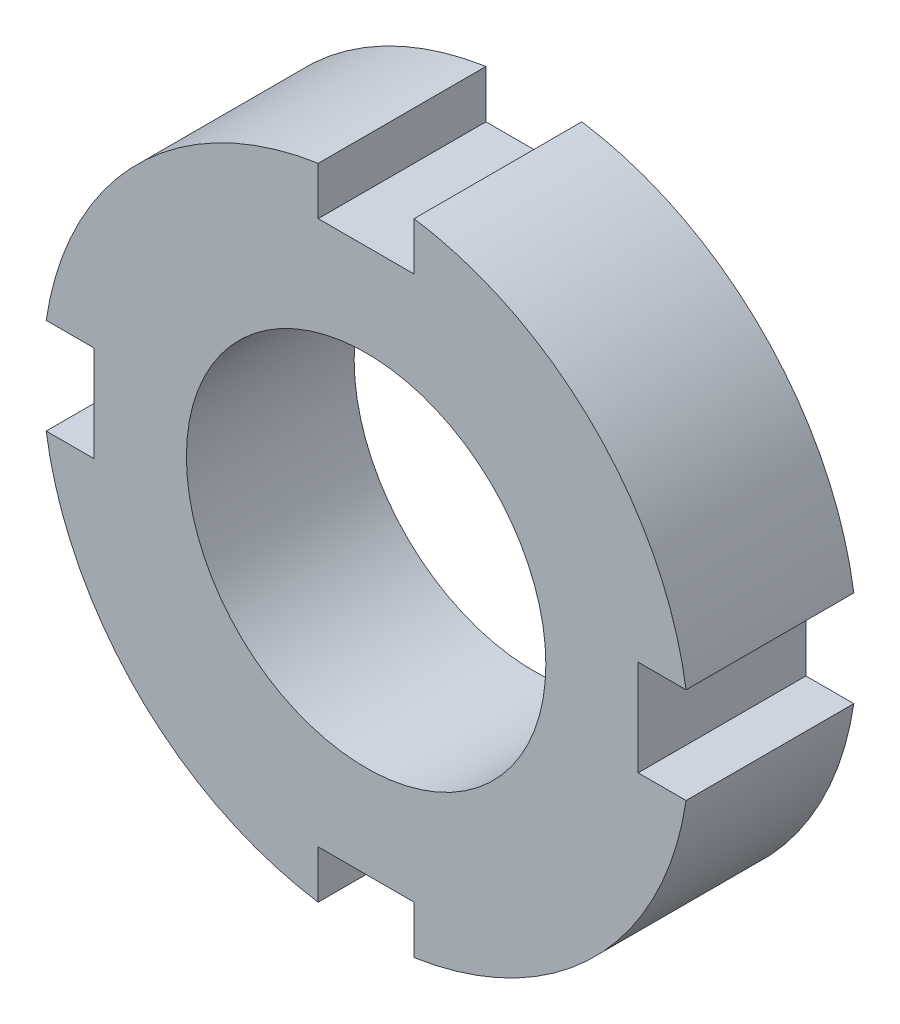
ISO-10303-21;
HEADER;
FILE_DESCRIPTION(('STEP AP214'),'2;1');
FILE_NAME('part.step','',(''),(''),'','','');
FILE_SCHEMA(('AUTOMOTIVE_DESIGN { 1 0 10303 214 1 1 1 1 }'));
ENDSEC;
DATA;
#1=APPLICATION_CONTEXT('core data for automotive mechanical design processes');
#2=APPLICATION_PROTOCOL_DEFINITION('international standard','automotive_design',2000,#1);
#3=PRODUCT_CONTEXT('',#1,'mechanical');
#4=PRODUCT('Part','Part','',(#3));
#5=PRODUCT_RELATED_PRODUCT_CATEGORY('part','',(#4));
#6=PRODUCT_DEFINITION_FORMATION('','',#4);
#7=PRODUCT_DEFINITION_CONTEXT('part definition',#1,'design');
#8=PRODUCT_DEFINITION('design','',#6,#7);
#9=PRODUCT_DEFINITION_SHAPE('','',#8);
#10=(LENGTH_UNIT() NAMED_UNIT(*) SI_UNIT(.MILLI.,.METRE.));
#11=(NAMED_UNIT(*) PLANE_ANGLE_UNIT() SI_UNIT($,.RADIAN.));
#12=(NAMED_UNIT(*) SI_UNIT($,.STERADIAN.) SOLID_ANGLE_UNIT());
#13=UNCERTAINTY_MEASURE_WITH_UNIT(LENGTH_MEASURE(1.E-05),#10,'distance_accuracy_value','');
#14=(GEOMETRIC_REPRESENTATION_CONTEXT(3) GLOBAL_UNCERTAINTY_ASSIGNED_CONTEXT((#13)) GLOBAL_UNIT_ASSIGNED_CONTEXT((#10,
#11,#12)) REPRESENTATION_CONTEXT('',''));
#15=CARTESIAN_POINT('',(0.,0.,0.));
#16=DIRECTION('',(0.,0.,1.));
#17=DIRECTION('',(1.,0.,0.));
#18=AXIS2_PLACEMENT_3D('',#15,#16,#17);
#19=CARTESIAN_POINT('',(0.,2.,7.));
#20=DIRECTION('',(0.,1.,0.));
#21=DIRECTION('',(-1.,0.,0.));
#22=AXIS2_PLACEMENT_3D('',#19,#20,#21);
#23=PLANE('',#22);
#24=DIRECTION('',(1.,0.,0.));
#25=VECTOR('',#24,1.);
#26=CARTESIAN_POINT('',(0.,2.,0.));
#27=LINE('',#26,#25);
#28=CARTESIAN_POINT('',(11.3510299228187,2.,0.));
#29=VERTEX_POINT('',#28);
#30=CARTESIAN_POINT('',(13.3510299228187,2.,0.));
#31=VERTEX_POINT('',#30);
#32=EDGE_CURVE('E198',#29,#31,#27,.T.);
#33=ORIENTED_EDGE('',*,*,#32,.T.);
#34=DIRECTION('',(0.,0.,-1.));
#35=VECTOR('',#34,1.);
#36=CARTESIAN_POINT('',(13.3510299228187,2.,7.));
#37=LINE('',#36,#35);
#38=CARTESIAN_POINT('',(13.3510299228187,2.,7.));
#39=VERTEX_POINT('',#38);
#40=EDGE_CURVE('E11',#39,#31,#37,.T.);
#41=ORIENTED_EDGE('',*,*,#40,.F.);
#42=DIRECTION('',(1.,0.,0.));
#43=VECTOR('',#42,1.);
#44=CARTESIAN_POINT('',(0.,2.,7.));
#45=LINE('',#44,#43);
#46=CARTESIAN_POINT('',(11.3510299228187,2.,7.));
#47=VERTEX_POINT('',#46);
#48=EDGE_CURVE('E311',#47,#39,#45,.T.);
#49=ORIENTED_EDGE('',*,*,#48,.F.);
#50=DIRECTION('',(0.,0.,-1.));
#51=VECTOR('',#50,1.);
#52=CARTESIAN_POINT('',(11.3510299228187,2.,7.));
#53=LINE('',#52,#51);
#54=EDGE_CURVE('E59',#47,#29,#53,.T.);
#55=ORIENTED_EDGE('',*,*,#54,.T.);
#56=EDGE_LOOP('',(#33,#41,#49,#55));
#57=FACE_BOUND('',#56,.T.);
#58=ADVANCED_FACE('F41',(#57),#23,.F.);
#59=CARTESIAN_POINT('',(0.,0.,7.));
#60=DIRECTION('',(0.,0.,-1.));
#61=DIRECTION('',(-1.,0.,0.));
#62=AXIS2_PLACEMENT_3D('',#59,#60,#61);
#63=CYLINDRICAL_SURFACE('',#62,13.5);
#64=CARTESIAN_POINT('',(0.,0.,0.));
#65=DIRECTION('',(0.,0.,1.));
#66=DIRECTION('',(1.,0.,0.));
#67=AXIS2_PLACEMENT_3D('',#64,#65,#66);
#68=CIRCLE('',#67,13.5);
#69=CARTESIAN_POINT('',(2.,13.3510299228187,0.));
#70=VERTEX_POINT('',#69);
#71=EDGE_CURVE('E201',#31,#70,#68,.T.);
#72=ORIENTED_EDGE('',*,*,#71,.T.);
#73=DIRECTION('',(0.,0.,-1.));
#74=VECTOR('',#73,1.);
#75=CARTESIAN_POINT('',(2.,13.3510299228187,7.));
#76=LINE('',#75,#74);
#77=CARTESIAN_POINT('',(2.,13.3510299228187,7.));
#78=VERTEX_POINT('',#77);
#79=EDGE_CURVE('E51',#78,#70,#76,.T.);
#80=ORIENTED_EDGE('',*,*,#79,.F.);
#81=CARTESIAN_POINT('',(0.,0.,7.));
#82=DIRECTION('',(0.,0.,1.));
#83=DIRECTION('',(1.,0.,0.));
#84=AXIS2_PLACEMENT_3D('',#81,#82,#83);
#85=CIRCLE('',#84,13.5);
#86=EDGE_CURVE('E121',#39,#78,#85,.T.);
#87=ORIENTED_EDGE('',*,*,#86,.F.);
#88=ORIENTED_EDGE('',*,*,#40,.T.);
#89=EDGE_LOOP('',(#72,#80,#87,#88));
#90=FACE_BOUND('',#89,.T.);
#91=ADVANCED_FACE('F292',(#90),#63,.T.);
#92=CARTESIAN_POINT('',(2.,0.,7.));
#93=DIRECTION('',(-1.,0.,0.));
#94=DIRECTION('',(0.,0.,1.));
#95=AXIS2_PLACEMENT_3D('',#92,#93,#94);
#96=PLANE('',#95);
#97=DIRECTION('',(0.,1.,0.));
#98=VECTOR('',#97,1.);
#99=CARTESIAN_POINT('',(2.,0.,0.));
#100=LINE('',#99,#98);
#101=CARTESIAN_POINT('',(2.,11.3510299228187,0.));
#102=VERTEX_POINT('',#101);
#103=EDGE_CURVE('E205',#102,#70,#100,.T.);
#104=ORIENTED_EDGE('',*,*,#103,.F.);
#105=DIRECTION('',(0.,0.,-1.));
#106=VECTOR('',#105,1.);
#107=CARTESIAN_POINT('',(2.,11.3510299228187,7.));
#108=LINE('',#107,#106);
#109=CARTESIAN_POINT('',(2.,11.3510299228187,7.));
#110=VERTEX_POINT('',#109);
#111=EDGE_CURVE('E283',#110,#102,#108,.T.);
#112=ORIENTED_EDGE('',*,*,#111,.F.);
#113=DIRECTION('',(0.,1.,0.));
#114=VECTOR('',#113,1.);
#115=CARTESIAN_POINT('',(2.,0.,7.));
#116=LINE('',#115,#114);
#117=EDGE_CURVE('E291',#110,#78,#116,.T.);
#118=ORIENTED_EDGE('',*,*,#117,.T.);
#119=ORIENTED_EDGE('',*,*,#79,.T.);
#120=EDGE_LOOP('',(#104,#112,#118,#119));
#121=FACE_BOUND('',#120,.T.);
#122=ADVANCED_FACE('F289',(#121),#96,.T.);
#123=CARTESIAN_POINT('',(0.,11.3510299228187,7.));
#124=DIRECTION('',(0.,1.,0.));
#125=DIRECTION('',(0.,0.,1.));
#126=AXIS2_PLACEMENT_3D('',#123,#124,#125);
#127=PLANE('',#126);
#128=DIRECTION('',(1.,0.,0.));
#129=VECTOR('',#128,1.);
#130=CARTESIAN_POINT('',(0.,11.3510299228187,0.));
#131=LINE('',#130,#129);
#132=CARTESIAN_POINT('',(-2.,11.3510299228187,0.));
#133=VERTEX_POINT('',#132);
#134=EDGE_CURVE('E210',#133,#102,#131,.T.);
#135=ORIENTED_EDGE('',*,*,#134,.F.);
#136=DIRECTION('',(0.,0.,-1.));
#137=VECTOR('',#136,1.);
#138=CARTESIAN_POINT('',(-2.,11.3510299228187,7.));
#139=LINE('',#138,#137);
#140=CARTESIAN_POINT('',(-2.,11.3510299228187,7.));
#141=VERTEX_POINT('',#140);
#142=EDGE_CURVE('E280',#141,#133,#139,.T.);
#143=ORIENTED_EDGE('',*,*,#142,.F.);
#144=DIRECTION('',(1.,0.,0.));
#145=VECTOR('',#144,1.);
#146=CARTESIAN_POINT('',(0.,11.3510299228187,7.));
#147=LINE('',#146,#145);
#148=EDGE_CURVE('E304',#141,#110,#147,.T.);
#149=ORIENTED_EDGE('',*,*,#148,.T.);
#150=ORIENTED_EDGE('',*,*,#111,.T.);
#151=EDGE_LOOP('',(#135,#143,#149,#150));
#152=FACE_BOUND('',#151,.T.);
#153=ADVANCED_FACE('F300',(#152),#127,.T.);
#154=CARTESIAN_POINT('',(-2.00000000000001,0.,7.));
#155=DIRECTION('',(-1.,0.,0.));
#156=DIRECTION('',(0.,-1.,0.));
#157=AXIS2_PLACEMENT_3D('',#154,#155,#156);
#158=PLANE('',#157);
#159=DIRECTION('',(0.,1.,0.));
#160=VECTOR('',#159,1.);
#161=CARTESIAN_POINT('',(-2.00000000000001,0.,0.));
#162=LINE('',#161,#160);
#163=CARTESIAN_POINT('',(-2.,13.3510299228187,0.));
#164=VERTEX_POINT('',#163);
#165=EDGE_CURVE('E214',#133,#164,#162,.T.);
#166=ORIENTED_EDGE('',*,*,#165,.T.);
#167=DIRECTION('',(0.,0.,-1.));
#168=VECTOR('',#167,1.);
#169=CARTESIAN_POINT('',(-2.,13.3510299228187,7.));
#170=LINE('',#169,#168);
#171=CARTESIAN_POINT('',(-2.,13.3510299228187,7.));
#172=VERTEX_POINT('',#171);
#173=EDGE_CURVE('E276',#172,#164,#170,.T.);
#174=ORIENTED_EDGE('',*,*,#173,.F.);
#175=DIRECTION('',(0.,1.,0.));
#176=VECTOR('',#175,1.);
#177=CARTESIAN_POINT('',(-2.00000000000001,0.,7.));
#178=LINE('',#177,#176);
#179=EDGE_CURVE('E309',#141,#172,#178,.T.);
#180=ORIENTED_EDGE('',*,*,#179,.F.);
#181=ORIENTED_EDGE('',*,*,#142,.T.);
#182=EDGE_LOOP('',(#166,#174,#180,#181));
#183=FACE_BOUND('',#182,.T.);
#184=ADVANCED_FACE('F394',(#183),#158,.F.);
#185=CARTESIAN_POINT('',(-13.3510299228187,2.,0.));
#186=VERTEX_POINT('',#185);
#187=EDGE_CURVE('E206',#164,#186,#68,.T.);
#188=ORIENTED_EDGE('',*,*,#187,.T.);
#189=DIRECTION('',(0.,0.,-1.));
#190=VECTOR('',#189,1.);
#191=CARTESIAN_POINT('',(-13.3510299228187,2.,7.));
#192=LINE('',#191,#190);
#193=CARTESIAN_POINT('',(-13.3510299228187,2.,7.));
#194=VERTEX_POINT('',#193);
#195=EDGE_CURVE('E273',#194,#186,#192,.T.);
#196=ORIENTED_EDGE('',*,*,#195,.F.);
#197=EDGE_CURVE('E312',#172,#194,#85,.T.);
#198=ORIENTED_EDGE('',*,*,#197,.F.);
#199=ORIENTED_EDGE('',*,*,#173,.T.);
#200=EDGE_LOOP('',(#188,#196,#198,#199));
#201=FACE_BOUND('',#200,.T.);
#202=ADVANCED_FACE('F352',(#201),#63,.T.);
#203=CARTESIAN_POINT('',(0.,2.,7.));
#204=DIRECTION('',(0.,-1.,0.));
#205=DIRECTION('',(1.,0.,0.));
#206=AXIS2_PLACEMENT_3D('',#203,#204,#205);
#207=PLANE('',#206);
#208=DIRECTION('',(-1.,0.,0.));
#209=VECTOR('',#208,1.);
#210=CARTESIAN_POINT('',(0.,2.,0.));
#211=LINE('',#210,#209);
#212=CARTESIAN_POINT('',(-11.3510299228187,2.,0.));
#213=VERTEX_POINT('',#212);
#214=EDGE_CURVE('E217',#213,#186,#211,.T.);
#215=ORIENTED_EDGE('',*,*,#214,.F.);
#216=DIRECTION('',(0.,0.,-1.));
#217=VECTOR('',#216,1.);
#218=CARTESIAN_POINT('',(-11.3510299228187,2.,7.));
#219=LINE('',#218,#217);
#220=CARTESIAN_POINT('',(-11.3510299228187,2.,7.));
#221=VERTEX_POINT('',#220);
#222=EDGE_CURVE('E270',#221,#213,#219,.T.);
#223=ORIENTED_EDGE('',*,*,#222,.F.);
#224=DIRECTION('',(-1.,0.,0.));
#225=VECTOR('',#224,1.);
#226=CARTESIAN_POINT('',(0.,2.,7.));
#227=LINE('',#226,#225);
#228=EDGE_CURVE('E317',#221,#194,#227,.T.);
#229=ORIENTED_EDGE('',*,*,#228,.T.);
#230=ORIENTED_EDGE('',*,*,#195,.T.);
#231=EDGE_LOOP('',(#215,#223,#229,#230));
#232=FACE_BOUND('',#231,.T.);
#233=ADVANCED_FACE('F359',(#232),#207,.T.);
#234=CARTESIAN_POINT('',(-11.3510299228187,0.,7.));
#235=DIRECTION('',(1.,0.,0.));
#236=DIRECTION('',(0.,0.,-1.));
#237=AXIS2_PLACEMENT_3D('',#234,#235,#236);
#238=PLANE('',#237);
#239=DIRECTION('',(0.,-1.,0.));
#240=VECTOR('',#239,1.);
#241=CARTESIAN_POINT('',(-11.3510299228187,0.,0.));
#242=LINE('',#241,#240);
#243=CARTESIAN_POINT('',(-11.3510299228187,-2.,0.));
#244=VERTEX_POINT('',#243);
#245=EDGE_CURVE('E221',#213,#244,#242,.T.);
#246=ORIENTED_EDGE('',*,*,#245,.T.);
#247=DIRECTION('',(0.,0.,-1.));
#248=VECTOR('',#247,1.);
#249=CARTESIAN_POINT('',(-11.3510299228187,-2.,7.));
#250=LINE('',#249,#248);
#251=CARTESIAN_POINT('',(-11.3510299228187,-2.,7.));
#252=VERTEX_POINT('',#251);
#253=EDGE_CURVE('E266',#252,#244,#250,.T.);
#254=ORIENTED_EDGE('',*,*,#253,.F.);
#255=DIRECTION('',(0.,-1.,0.));
#256=VECTOR('',#255,1.);
#257=CARTESIAN_POINT('',(-11.3510299228187,0.,7.));
#258=LINE('',#257,#256);
#259=EDGE_CURVE('E321',#221,#252,#258,.T.);
#260=ORIENTED_EDGE('',*,*,#259,.F.);
#261=ORIENTED_EDGE('',*,*,#222,.T.);
#262=EDGE_LOOP('',(#246,#254,#260,#261));
#263=FACE_BOUND('',#262,.T.);
#264=ADVANCED_FACE('F375',(#263),#238,.F.);
#265=CARTESIAN_POINT('',(0.,-2.,7.));
#266=DIRECTION('',(0.,-1.,0.));
#267=DIRECTION('',(0.,0.,-1.));
#268=AXIS2_PLACEMENT_3D('',#265,#266,#267);
#269=PLANE('',#268);
#270=DIRECTION('',(-1.,0.,0.));
#271=VECTOR('',#270,1.);
#272=CARTESIAN_POINT('',(0.,-2.,0.));
#273=LINE('',#272,#271);
#274=CARTESIAN_POINT('',(-13.3510299228187,-2.,0.));
#275=VERTEX_POINT('',#274);
#276=EDGE_CURVE('E224',#244,#275,#273,.T.);
#277=ORIENTED_EDGE('',*,*,#276,.T.);
#278=DIRECTION('',(0.,0.,-1.));
#279=VECTOR('',#278,1.);
#280=CARTESIAN_POINT('',(-13.3510299228187,-2.,7.));
#281=LINE('',#280,#279);
#282=CARTESIAN_POINT('',(-13.3510299228187,-2.,7.));
#283=VERTEX_POINT('',#282);
#284=EDGE_CURVE('E262',#283,#275,#281,.T.);
#285=ORIENTED_EDGE('',*,*,#284,.F.);
#286=DIRECTION('',(-1.,0.,0.));
#287=VECTOR('',#286,1.);
#288=CARTESIAN_POINT('',(0.,-2.,7.));
#289=LINE('',#288,#287);
#290=EDGE_CURVE('E324',#252,#283,#289,.T.);
#291=ORIENTED_EDGE('',*,*,#290,.F.);
#292=ORIENTED_EDGE('',*,*,#253,.T.);
#293=EDGE_LOOP('',(#277,#285,#291,#292));
#294=FACE_BOUND('',#293,.T.);
#295=ADVANCED_FACE('F373',(#294),#269,.F.);
#296=CARTESIAN_POINT('',(-2.,-13.3510299228187,0.));
#297=VERTEX_POINT('',#296);
#298=EDGE_CURVE('E227',#275,#297,#68,.T.);
#299=ORIENTED_EDGE('',*,*,#298,.T.);
#300=DIRECTION('',(0.,0.,-1.));
#301=VECTOR('',#300,1.);
#302=CARTESIAN_POINT('',(-2.,-13.3510299228187,7.));
#303=LINE('',#302,#301);
#304=CARTESIAN_POINT('',(-2.,-13.3510299228187,7.));
#305=VERTEX_POINT('',#304);
#306=EDGE_CURVE('E259',#305,#297,#303,.T.);
#307=ORIENTED_EDGE('',*,*,#306,.F.);
#308=EDGE_CURVE('E174',#283,#305,#85,.T.);
#309=ORIENTED_EDGE('',*,*,#308,.F.);
#310=ORIENTED_EDGE('',*,*,#284,.T.);
#311=EDGE_LOOP('',(#299,#307,#309,#310));
#312=FACE_BOUND('',#311,.T.);
#313=ADVANCED_FACE('F368',(#312),#63,.T.);
#314=CARTESIAN_POINT('',(-2.00000000000001,0.,7.));
#315=DIRECTION('',(1.,0.,0.));
#316=DIRECTION('',(0.,1.,0.));
#317=AXIS2_PLACEMENT_3D('',#314,#315,#316);
#318=PLANE('',#317);
#319=DIRECTION('',(0.,-1.,0.));
#320=VECTOR('',#319,1.);
#321=CARTESIAN_POINT('',(-2.00000000000001,0.,0.));
#322=LINE('',#321,#320);
#323=CARTESIAN_POINT('',(-2.,-11.3510299228187,0.));
#324=VERTEX_POINT('',#323);
#325=EDGE_CURVE('E228',#324,#297,#322,.T.);
#326=ORIENTED_EDGE('',*,*,#325,.F.);
#327=DIRECTION('',(0.,0.,-1.));
#328=VECTOR('',#327,1.);
#329=CARTESIAN_POINT('',(-2.,-11.3510299228187,7.));
#330=LINE('',#329,#328);
#331=CARTESIAN_POINT('',(-2.,-11.3510299228187,7.));
#332=VERTEX_POINT('',#331);
#333=EDGE_CURVE('E256',#332,#324,#330,.T.);
#334=ORIENTED_EDGE('',*,*,#333,.F.);
#335=DIRECTION('',(0.,-1.,0.));
#336=VECTOR('',#335,1.);
#337=CARTESIAN_POINT('',(-2.00000000000001,0.,7.));
#338=LINE('',#337,#336);
#339=EDGE_CURVE('E327',#332,#305,#338,.T.);
#340=ORIENTED_EDGE('',*,*,#339,.T.);
#341=ORIENTED_EDGE('',*,*,#306,.T.);
#342=EDGE_LOOP('',(#326,#334,#340,#341));
#343=FACE_BOUND('',#342,.T.);
#344=ADVANCED_FACE('F371',(#343),#318,.T.);
#345=CARTESIAN_POINT('',(0.,-11.3510299228187,7.));
#346=DIRECTION('',(0.,1.,0.));
#347=DIRECTION('',(0.,0.,1.));
#348=AXIS2_PLACEMENT_3D('',#345,#346,#347);
#349=PLANE('',#348);
#350=DIRECTION('',(1.,0.,0.));
#351=VECTOR('',#350,1.);
#352=CARTESIAN_POINT('',(0.,-11.3510299228187,0.));
#353=LINE('',#352,#351);
#354=CARTESIAN_POINT('',(2.,-11.3510299228187,0.));
#355=VERTEX_POINT('',#354);
#356=EDGE_CURVE('E232',#324,#355,#353,.T.);
#357=ORIENTED_EDGE('',*,*,#356,.T.);
#358=DIRECTION('',(0.,0.,-1.));
#359=VECTOR('',#358,1.);
#360=CARTESIAN_POINT('',(2.,-11.3510299228187,7.));
#361=LINE('',#360,#359);
#362=CARTESIAN_POINT('',(2.,-11.3510299228187,7.));
#363=VERTEX_POINT('',#362);
#364=EDGE_CURVE('E252',#363,#355,#361,.T.);
#365=ORIENTED_EDGE('',*,*,#364,.F.);
#366=DIRECTION('',(1.,0.,0.));
#367=VECTOR('',#366,1.);
#368=CARTESIAN_POINT('',(0.,-11.3510299228187,7.));
#369=LINE('',#368,#367);
#370=EDGE_CURVE('E330',#332,#363,#369,.T.);
#371=ORIENTED_EDGE('',*,*,#370,.F.);
#372=ORIENTED_EDGE('',*,*,#333,.T.);
#373=EDGE_LOOP('',(#357,#365,#371,#372));
#374=FACE_BOUND('',#373,.T.);
#375=ADVANCED_FACE('F337',(#374),#349,.F.);
#376=CARTESIAN_POINT('',(2.,0.,7.));
#377=DIRECTION('',(1.,0.,0.));
#378=DIRECTION('',(0.,0.,-1.));
#379=AXIS2_PLACEMENT_3D('',#376,#377,#378);
#380=PLANE('',#379);
#381=DIRECTION('',(0.,-1.,0.));
#382=VECTOR('',#381,1.);
#383=CARTESIAN_POINT('',(2.,0.,0.));
#384=LINE('',#383,#382);
#385=CARTESIAN_POINT('',(2.,-13.3510299228187,0.));
#386=VERTEX_POINT('',#385);
#387=EDGE_CURVE('E235',#355,#386,#384,.T.);
#388=ORIENTED_EDGE('',*,*,#387,.T.);
#389=DIRECTION('',(0.,0.,-1.));
#390=VECTOR('',#389,1.);
#391=CARTESIAN_POINT('',(2.,-13.3510299228187,7.));
#392=LINE('',#391,#390);
#393=CARTESIAN_POINT('',(2.,-13.3510299228187,7.));
#394=VERTEX_POINT('',#393);
#395=EDGE_CURVE('E183',#394,#386,#392,.T.);
#396=ORIENTED_EDGE('',*,*,#395,.F.);
#397=DIRECTION('',(0.,-1.,0.));
#398=VECTOR('',#397,1.);
#399=CARTESIAN_POINT('',(2.,0.,7.));
#400=LINE('',#399,#398);
#401=EDGE_CURVE('E168',#363,#394,#400,.T.);
#402=ORIENTED_EDGE('',*,*,#401,.F.);
#403=ORIENTED_EDGE('',*,*,#364,.T.);
#404=EDGE_LOOP('',(#388,#396,#402,#403));
#405=FACE_BOUND('',#404,.T.);
#406=ADVANCED_FACE('F341',(#405),#380,.F.);
#407=CARTESIAN_POINT('',(13.3510299228187,-2.,0.));
#408=VERTEX_POINT('',#407);
#409=EDGE_CURVE('E179',#386,#408,#68,.T.);
#410=ORIENTED_EDGE('',*,*,#409,.T.);
#411=DIRECTION('',(0.,0.,-1.));
#412=VECTOR('',#411,1.);
#413=CARTESIAN_POINT('',(13.3510299228187,-2.,7.));
#414=LINE('',#413,#412);
#415=CARTESIAN_POINT('',(13.3510299228187,-2.,7.));
#416=VERTEX_POINT('',#415);
#417=EDGE_CURVE('E176',#416,#408,#414,.T.);
#418=ORIENTED_EDGE('',*,*,#417,.F.);
#419=EDGE_CURVE('E161',#394,#416,#85,.T.);
#420=ORIENTED_EDGE('',*,*,#419,.F.);
#421=ORIENTED_EDGE('',*,*,#395,.T.);
#422=EDGE_LOOP('',(#410,#418,#420,#421));
#423=FACE_BOUND('',#422,.T.);
#424=ADVANCED_FACE('F177',(#423),#63,.T.);
#425=CARTESIAN_POINT('',(0.,-2.,7.));
#426=DIRECTION('',(0.,1.,0.));
#427=DIRECTION('',(0.,0.,1.));
#428=AXIS2_PLACEMENT_3D('',#425,#426,#427);
#429=PLANE('',#428);
#430=DIRECTION('',(1.,0.,0.));
#431=VECTOR('',#430,1.);
#432=CARTESIAN_POINT('',(0.,-2.,0.));
#433=LINE('',#432,#431);
#434=CARTESIAN_POINT('',(11.3510299228187,-2.,0.));
#435=VERTEX_POINT('',#434);
#436=EDGE_CURVE('E238',#435,#408,#433,.T.);
#437=ORIENTED_EDGE('',*,*,#436,.F.);
#438=DIRECTION('',(0.,0.,-1.));
#439=VECTOR('',#438,1.);
#440=CARTESIAN_POINT('',(11.3510299228187,-2.,7.));
#441=LINE('',#440,#439);
#442=CARTESIAN_POINT('',(11.3510299228187,-2.,7.));
#443=VERTEX_POINT('',#442);
#444=EDGE_CURVE('E109',#443,#435,#441,.T.);
#445=ORIENTED_EDGE('',*,*,#444,.F.);
#446=DIRECTION('',(1.,0.,0.));
#447=VECTOR('',#446,1.);
#448=CARTESIAN_POINT('',(0.,-2.,7.));
#449=LINE('',#448,#447);
#450=EDGE_CURVE('E166',#443,#416,#449,.T.);
#451=ORIENTED_EDGE('',*,*,#450,.T.);
#452=ORIENTED_EDGE('',*,*,#417,.T.);
#453=EDGE_LOOP('',(#437,#445,#451,#452));
#454=FACE_BOUND('',#453,.T.);
#455=ADVANCED_FACE('F185',(#454),#429,.T.);
#456=CARTESIAN_POINT('',(0.,0.,7.));
#457=DIRECTION('',(0.,0.,-1.));
#458=DIRECTION('',(-1.,0.,0.));
#459=AXIS2_PLACEMENT_3D('',#456,#457,#458);
#460=CYLINDRICAL_SURFACE('',#459,7.5);
#461=CARTESIAN_POINT('',(0.,0.,7.));
#462=DIRECTION('',(0.,0.,1.));
#463=DIRECTION('',(1.,0.,0.));
#464=AXIS2_PLACEMENT_3D('',#461,#462,#463);
#465=CIRCLE('',#464,7.5);
#466=CARTESIAN_POINT('',(7.5,0.,7.));
#467=VERTEX_POINT('',#466);
#468=EDGE_CURVE('E245',#467,#467,#465,.T.);
#469=ORIENTED_EDGE('',*,*,#468,.T.);
#470=EDGE_LOOP('',(#469));
#471=FACE_BOUND('',#470,.T.);
#472=CARTESIAN_POINT('',(0.,0.,0.));
#473=DIRECTION('',(0.,0.,1.));
#474=DIRECTION('',(1.,0.,0.));
#475=AXIS2_PLACEMENT_3D('',#472,#473,#474);
#476=CIRCLE('',#475,7.5);
#477=CARTESIAN_POINT('',(7.5,0.,0.));
#478=VERTEX_POINT('',#477);
#479=EDGE_CURVE('E194',#478,#478,#476,.T.);
#480=ORIENTED_EDGE('',*,*,#479,.F.);
#481=EDGE_LOOP('',(#480));
#482=FACE_BOUND('',#481,.T.);
#483=ADVANCED_FACE('F43',(#471,#482),#460,.F.);
#484=CARTESIAN_POINT('',(11.3510299228187,0.,7.));
#485=DIRECTION('',(1.,0.,0.));
#486=DIRECTION('',(0.,0.,-1.));
#487=AXIS2_PLACEMENT_3D('',#484,#485,#486);
#488=PLANE('',#487);
#489=DIRECTION('',(0.,-1.,0.));
#490=VECTOR('',#489,1.);
#491=CARTESIAN_POINT('',(11.3510299228187,0.,0.));
#492=LINE('',#491,#490);
#493=EDGE_CURVE('E241',#29,#435,#492,.T.);
#494=ORIENTED_EDGE('',*,*,#493,.F.);
#495=ORIENTED_EDGE('',*,*,#54,.F.);
#496=DIRECTION('',(0.,-1.,0.));
#497=VECTOR('',#496,1.);
#498=CARTESIAN_POINT('',(11.3510299228187,0.,7.));
#499=LINE('',#498,#497);
#500=EDGE_CURVE('E187',#47,#443,#499,.T.);
#501=ORIENTED_EDGE('',*,*,#500,.T.);
#502=ORIENTED_EDGE('',*,*,#444,.T.);
#503=EDGE_LOOP('',(#494,#495,#501,#502));
#504=FACE_BOUND('',#503,.T.);
#505=ADVANCED_FACE('F499',(#504),#488,.T.);
#506=CARTESIAN_POINT('',(0.,0.,7.));
#507=DIRECTION('',(0.,0.,1.));
#508=DIRECTION('',(1.,0.,0.));
#509=AXIS2_PLACEMENT_3D('',#506,#507,#508);
#510=PLANE('',#509);
#511=ORIENTED_EDGE('',*,*,#468,.F.);
#512=EDGE_LOOP('',(#511));
#513=FACE_BOUND('',#512,.T.);
#514=ORIENTED_EDGE('',*,*,#48,.T.);
#515=ORIENTED_EDGE('',*,*,#86,.T.);
#516=ORIENTED_EDGE('',*,*,#117,.F.);
#517=ORIENTED_EDGE('',*,*,#148,.F.);
#518=ORIENTED_EDGE('',*,*,#179,.T.);
#519=ORIENTED_EDGE('',*,*,#197,.T.);
#520=ORIENTED_EDGE('',*,*,#228,.F.);
#521=ORIENTED_EDGE('',*,*,#259,.T.);
#522=ORIENTED_EDGE('',*,*,#290,.T.);
#523=ORIENTED_EDGE('',*,*,#308,.T.);
#524=ORIENTED_EDGE('',*,*,#339,.F.);
#525=ORIENTED_EDGE('',*,*,#370,.T.);
#526=ORIENTED_EDGE('',*,*,#401,.T.);
#527=ORIENTED_EDGE('',*,*,#419,.T.);
#528=ORIENTED_EDGE('',*,*,#450,.F.);
#529=ORIENTED_EDGE('',*,*,#500,.F.);
#530=EDGE_LOOP('',(#514,#515,#516,#517,#518,#519,#520,#521,#522,#523,#524,#525,#526,#527,#528,#529));
#531=FACE_BOUND('',#530,.T.);
#532=ADVANCED_FACE('F163',(#513,#531),#510,.T.);
#533=CARTESIAN_POINT('',(0.,0.,0.));
#534=DIRECTION('',(0.,0.,1.));
#535=DIRECTION('',(1.,0.,0.));
#536=AXIS2_PLACEMENT_3D('',#533,#534,#535);
#537=PLANE('',#536);
#538=ORIENTED_EDGE('',*,*,#479,.T.);
#539=EDGE_LOOP('',(#538));
#540=FACE_BOUND('',#539,.T.);
#541=ORIENTED_EDGE('',*,*,#32,.F.);
#542=ORIENTED_EDGE('',*,*,#493,.T.);
#543=ORIENTED_EDGE('',*,*,#436,.T.);
#544=ORIENTED_EDGE('',*,*,#409,.F.);
#545=ORIENTED_EDGE('',*,*,#387,.F.);
#546=ORIENTED_EDGE('',*,*,#356,.F.);
#547=ORIENTED_EDGE('',*,*,#325,.T.);
#548=ORIENTED_EDGE('',*,*,#298,.F.);
#549=ORIENTED_EDGE('',*,*,#276,.F.);
#550=ORIENTED_EDGE('',*,*,#245,.F.);
#551=ORIENTED_EDGE('',*,*,#214,.T.);
#552=ORIENTED_EDGE('',*,*,#187,.F.);
#553=ORIENTED_EDGE('',*,*,#165,.F.);
#554=ORIENTED_EDGE('',*,*,#134,.T.);
#555=ORIENTED_EDGE('',*,*,#103,.T.);
#556=ORIENTED_EDGE('',*,*,#71,.F.);
#557=EDGE_LOOP('',(#541,#542,#543,#544,#545,#546,#547,#548,#549,#550,#551,#552,#553,#554,#555,#556));
#558=FACE_BOUND('',#557,.T.);
#559=ADVANCED_FACE('F295',(#540,#558),#537,.F.);
#560=CLOSED_SHELL('',(#58,#91,#122,#153,#184,#202,#233,#264,#295,#313,#344,#375,#406,#424,#455,
#483,#505,#532,#559));
#561=MANIFOLD_SOLID_BREP('B2',#560);
#562=ADVANCED_BREP_SHAPE_REPRESENTATION('',(#18,#561),#14);
#563=SHAPE_DEFINITION_REPRESENTATION(#9,#562);
ENDSEC;
END-ISO-10303-21;
